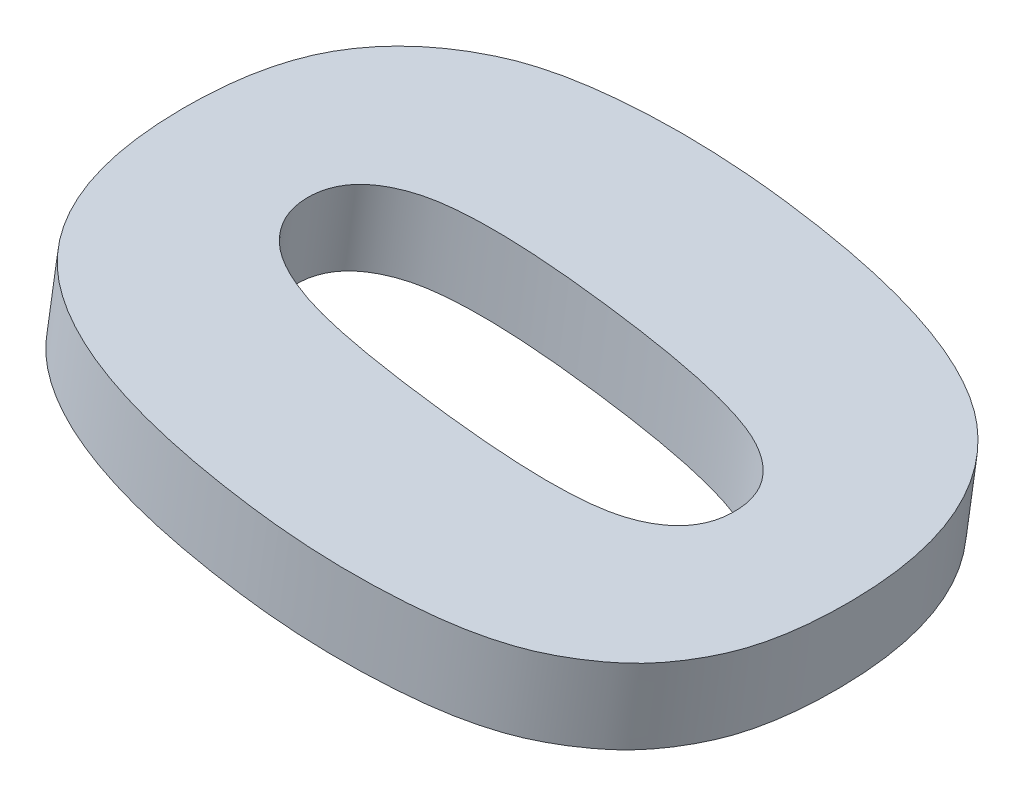
ISO-10303-21;
HEADER;
FILE_DESCRIPTION(('STEP AP214'),'2;1');
FILE_NAME('part.step','',(''),(''),'','','');
FILE_SCHEMA(('AUTOMOTIVE_DESIGN { 1 0 10303 214 1 1 1 1 }'));
ENDSEC;
DATA;
#1=APPLICATION_CONTEXT('core data for automotive mechanical design processes');
#2=APPLICATION_PROTOCOL_DEFINITION('international standard','automotive_design',2000,#1);
#3=PRODUCT_CONTEXT('',#1,'mechanical');
#4=PRODUCT('Part','Part','',(#3));
#5=PRODUCT_RELATED_PRODUCT_CATEGORY('part','',(#4));
#6=PRODUCT_DEFINITION_FORMATION('','',#4);
#7=PRODUCT_DEFINITION_CONTEXT('part definition',#1,'design');
#8=PRODUCT_DEFINITION('design','',#6,#7);
#9=PRODUCT_DEFINITION_SHAPE('','',#8);
#10=(LENGTH_UNIT() NAMED_UNIT(*) SI_UNIT(.MILLI.,.METRE.));
#11=(NAMED_UNIT(*) PLANE_ANGLE_UNIT() SI_UNIT($,.RADIAN.));
#12=(NAMED_UNIT(*) SI_UNIT($,.STERADIAN.) SOLID_ANGLE_UNIT());
#13=UNCERTAINTY_MEASURE_WITH_UNIT(LENGTH_MEASURE(1.E-05),#10,'distance_accuracy_value','');
#14=(GEOMETRIC_REPRESENTATION_CONTEXT(3) GLOBAL_UNCERTAINTY_ASSIGNED_CONTEXT((#13)) GLOBAL_UNIT_ASSIGNED_CONTEXT((#10,
#11,#12)) REPRESENTATION_CONTEXT('',''));
#15=CARTESIAN_POINT('',(0.,0.,0.));
#16=DIRECTION('',(0.,0.,1.));
#17=DIRECTION('',(1.,0.,0.));
#18=AXIS2_PLACEMENT_3D('',#15,#16,#17);
#19=CARTESIAN_POINT('',(844.513384833249,617.732570236416,2588.69411825762));
#20=CARTESIAN_POINT('',(867.101764245744,614.557980539209,2588.69411825762));
#21=CARTESIAN_POINT('',(876.127178850794,613.295858792178,2596.90693988577));
#22=CARTESIAN_POINT('',(885.152593455844,612.033737045148,2605.11976151392));
#23=CARTESIAN_POINT('',(885.154375306636,612.046415572319,2621.92739647385));
#24=CARTESIAN_POINT('',(885.155231520652,612.05250785161,2630.00379249356));
#25=CARTESIAN_POINT('',(883.183350857784,612.33362543138,2635.18796561432));
#26=CARTESIAN_POINT('',(881.211470194915,612.614743011151,2640.37213873507));
#27=CARTESIAN_POINT('',(878.050524974661,613.061503517472,2643.64635333766));
#28=CARTESIAN_POINT('',(874.889579754406,613.508264023792,2646.92056794024));
#29=CARTESIAN_POINT('',(871.404251899606,613.999543120022,2648.80324133673));
#30=CARTESIAN_POINT('',(867.918924044806,614.490822216253,2650.68591473322));
#31=CARTESIAN_POINT('',(863.275818466317,615.144262639921,2651.84875180586));
#32=CARTESIAN_POINT('',(854.409486429717,616.392052435875,2654.06926982256));
#33=CARTESIAN_POINT('',(844.790511464587,617.743911206456,2654.06926982256));
#34=CARTESIAN_POINT('',(823.228876570842,620.774201371972,2654.06926982256));
#35=CARTESIAN_POINT('',(813.230846303302,622.173665981263,2646.70228696674));
#36=CARTESIAN_POINT('',(803.232816035762,623.573130590554,2639.33530411092));
#37=CARTESIAN_POINT('',(803.230906909914,623.559546454299,2621.32712379671));
#38=CARTESIAN_POINT('',(803.229836642393,623.551931105186,2611.23162877208));
#39=CARTESIAN_POINT('',(806.417489052835,623.099150384108,2605.01062102716));
#40=CARTESIAN_POINT('',(809.605141463277,622.64636966303,2598.78961328225));
#41=CARTESIAN_POINT('',(815.748887883955,621.779838493564,2594.7805181873));
#42=CARTESIAN_POINT('',(820.142053637802,621.16021411494,2591.91376261683));
#43=CARTESIAN_POINT('',(827.73438849375,620.091942712191,2590.30394043722));
#44=CARTESIAN_POINT('',(835.326723349699,619.023671309443,2588.69411825762));
#45=CARTESIAN_POINT('',(844.513384833249,617.732570236416,2588.69411825762));
#46=B_SPLINE_CURVE_WITH_KNOTS('',2,(#19,#20,#21,#22,#23,#24,#25,#26,#27,#28,#29,#30,#31,#32,#33,
#34,#35,#36,#37,#38,#39,#40,#41,#42,#43,#44,#45),.UNSPECIFIED.,.T.,.F.,(3,2,2,2,2,2,2,2,2,2,2,2,
2,3),(0.,1.,2.,3.,4.,5.,6.,7.,8.,9.,10.,11.,12.,13.),.UNSPECIFIED.);
#47=DIRECTION('',(-0.139173060582166,-0.990267781437723,0.000761744447259926));
#48=VECTOR('',#47,1.);
#49=SURFACE_OF_LINEAR_EXTRUSION('',#46,#48);
#50=CARTESIAN_POINT('',(844.513384833249,617.732570236416,2588.69411825762));
#51=VERTEX_POINT('',#50);
#52=EDGE_CURVE('E25',#51,#51,#46,.T.);
#53=ORIENTED_EDGE('',*,*,#52,.T.);
#54=EDGE_LOOP('',(#53));
#55=FACE_BOUND('',#54,.T.);
#56=CARTESIAN_POINT('',(843.121654227428,607.829892422038,2588.70173570209));
#57=CARTESIAN_POINT('',(865.710033639923,604.655302724832,2588.70173570209));
#58=CARTESIAN_POINT('',(874.735448244972,603.393180977801,2596.91455733024));
#59=CARTESIAN_POINT('',(883.760862850022,602.131059230771,2605.12737895839));
#60=CARTESIAN_POINT('',(883.762644700814,602.143737757942,2621.93501391832));
#61=CARTESIAN_POINT('',(883.763500914831,602.149830037233,2630.01140993803));
#62=CARTESIAN_POINT('',(881.791620251962,602.430947617003,2635.19558305879));
#63=CARTESIAN_POINT('',(879.819739589094,602.712065196774,2640.37975617954));
#64=CARTESIAN_POINT('',(876.658794368839,603.158825703094,2643.65397078213));
#65=CARTESIAN_POINT('',(873.497849148584,603.605586209415,2646.92818538472));
#66=CARTESIAN_POINT('',(870.012521293784,604.096865305645,2648.8108587812));
#67=CARTESIAN_POINT('',(866.527193438984,604.588144401875,2650.69353217769));
#68=CARTESIAN_POINT('',(861.884087860495,605.241584825544,2651.85636925032));
#69=CARTESIAN_POINT('',(853.017755823895,606.489374621498,2654.07688726703));
#70=CARTESIAN_POINT('',(843.398780858766,607.841233392079,2654.07688726703));
#71=CARTESIAN_POINT('',(821.83714596502,610.871523557595,2654.07688726703));
#72=CARTESIAN_POINT('',(811.83911569748,612.270988166886,2646.70990441121));
#73=CARTESIAN_POINT('',(801.841085429941,613.670452776177,2639.34292155539));
#74=CARTESIAN_POINT('',(801.839176304092,613.656868639921,2621.33474124118));
#75=CARTESIAN_POINT('',(801.838106036571,613.649253290808,2611.23924621655));
#76=CARTESIAN_POINT('',(805.025758447013,613.196472569731,2605.01823847163));
#77=CARTESIAN_POINT('',(808.213410857456,612.743691848653,2598.79723072673));
#78=CARTESIAN_POINT('',(814.357157278134,611.877160679187,2594.78813563177));
#79=CARTESIAN_POINT('',(818.75032303198,611.257536300563,2591.9213800613));
#80=CARTESIAN_POINT('',(826.342657887929,610.189264897814,2590.3115578817));
#81=CARTESIAN_POINT('',(833.934992743877,609.120993495065,2588.70173570209));
#82=CARTESIAN_POINT('',(843.121654227428,607.829892422038,2588.70173570209));
#83=B_SPLINE_CURVE_WITH_KNOTS('',2,(#56,#57,#58,#59,#60,#61,#62,#63,#64,#65,#66,#67,#68,#69,#70,
#71,#72,#73,#74,#75,#76,#77,#78,#79,#80,#81,#82),.UNSPECIFIED.,.T.,.F.,(3,2,2,2,2,2,2,2,2,2,2,2,
2,3),(0.,1.,2.,3.,4.,5.,6.,7.,8.,9.,10.,11.,12.,13.),.UNSPECIFIED.);
#84=CARTESIAN_POINT('',(843.121654227428,607.829892422038,2588.70173570209));
#85=VERTEX_POINT('',#84);
#86=EDGE_CURVE('E36',#85,#85,#83,.T.);
#87=ORIENTED_EDGE('',*,*,#86,.F.);
#88=EDGE_LOOP('',(#87));
#89=FACE_BOUND('',#88,.T.);
#90=ADVANCED_FACE('F15',(#55,#89),#49,.T.);
#91=CARTESIAN_POINT('',(844.461682880908,617.756795224511,2610.74049658168));
#92=CARTESIAN_POINT('',(829.330711025648,619.883314638908,2610.74049658168));
#93=CARTESIAN_POINT('',(823.791980911796,620.663810259259,2613.44172362882));
#94=CARTESIAN_POINT('',(818.253250797944,621.44430587961,2616.14295067595));
#95=CARTESIAN_POINT('',(818.253794609549,621.448175300241,2621.27255355333));
#96=CARTESIAN_POINT('',(818.2541532938,621.450727471295,2624.65590864267));
#97=CARTESIAN_POINT('',(820.605121077843,621.122230455085,2627.1388547163));
#98=CARTESIAN_POINT('',(822.956088861885,620.793733438876,2629.62180078992));
#99=CARTESIAN_POINT('',(828.035896652879,620.080715519673,2630.79506102252));
#100=CARTESIAN_POINT('',(833.115704443872,619.36769760047,2631.96832125511));
#101=CARTESIAN_POINT('',(843.869502298146,617.856349873809,2631.96832125511));
#102=CARTESIAN_POINT('',(859.648944375774,615.638693913081,2631.96832125511));
#103=CARTESIAN_POINT('',(865.079596119231,614.873387717118,2629.26709420797));
#104=CARTESIAN_POINT('',(870.510247862689,614.108081521155,2626.56586716084));
#105=CARTESIAN_POINT('',(870.509675124934,614.104006280278,2621.16341306658));
#106=CARTESIAN_POINT('',(870.50909081672,614.099848711303,2615.65181848556));
#107=CARTESIAN_POINT('',(864.969813998648,614.876454329,2613.19615753362));
#108=CARTESIAN_POINT('',(859.430537180576,615.653059946696,2610.74049658168));
#109=CARTESIAN_POINT('',(844.461682880908,617.756795224511,2610.74049658168));
#110=B_SPLINE_CURVE_WITH_KNOTS('',2,(#91,#92,#93,#94,#95,#96,#97,#98,#99,#100,#101,#102,#103,
#104,#105,#106,#107,#108,#109),.UNSPECIFIED.,.T.,.F.,(3,2,2,2,2,2,2,2,2,3),(0.,1.,2.,3.,4.,5.,
6.,7.,8.,9.),.UNSPECIFIED.);
#111=DIRECTION('',(-0.139173060582166,-0.990267781437723,0.000761744447259926));
#112=VECTOR('',#111,1.);
#113=SURFACE_OF_LINEAR_EXTRUSION('',#110,#112);
#114=CARTESIAN_POINT('',(844.461682880908,617.756795224511,2610.74049658168));
#115=VERTEX_POINT('',#114);
#116=EDGE_CURVE('E10',#115,#115,#110,.T.);
#117=ORIENTED_EDGE('',*,*,#116,.T.);
#118=EDGE_LOOP('',(#117));
#119=FACE_BOUND('',#118,.T.);
#120=CARTESIAN_POINT('',(843.069952275086,607.854117410133,2610.74811402616));
#121=CARTESIAN_POINT('',(827.938980419827,609.98063682453,2610.74811402616));
#122=CARTESIAN_POINT('',(822.400250305974,610.761132444882,2613.44934107329));
#123=CARTESIAN_POINT('',(816.861520192123,611.541628065233,2616.15056812043));
#124=CARTESIAN_POINT('',(816.862064003728,611.545497485864,2621.2801709978));
#125=CARTESIAN_POINT('',(816.862422687978,611.548049656918,2624.66352608714));
#126=CARTESIAN_POINT('',(819.213390472021,611.219552640708,2627.14647216077));
#127=CARTESIAN_POINT('',(821.564358256064,610.891055624498,2629.62941823439));
#128=CARTESIAN_POINT('',(826.644166047057,610.178037705295,2630.80267846699));
#129=CARTESIAN_POINT('',(831.72397383805,609.465019786093,2631.97593869958));
#130=CARTESIAN_POINT('',(842.477771692324,607.953672059432,2631.97593869958));
#131=CARTESIAN_POINT('',(858.257213769952,605.736016098704,2631.97593869958));
#132=CARTESIAN_POINT('',(863.68786551341,604.970709902741,2629.27471165245));
#133=CARTESIAN_POINT('',(869.118517256867,604.205403706778,2626.57348460531));
#134=CARTESIAN_POINT('',(869.117944519112,604.201328465901,2621.17103051105));
#135=CARTESIAN_POINT('',(869.117360210898,604.197170896926,2615.65943593004));
#136=CARTESIAN_POINT('',(863.578083392826,604.973776514623,2613.20377497809));
#137=CARTESIAN_POINT('',(858.038806574754,605.750382132319,2610.74811402616));
#138=CARTESIAN_POINT('',(843.069952275086,607.854117410133,2610.74811402616));
#139=B_SPLINE_CURVE_WITH_KNOTS('',2,(#120,#121,#122,#123,#124,#125,#126,#127,#128,#129,#130,
#131,#132,#133,#134,#135,#136,#137,#138),.UNSPECIFIED.,.T.,.F.,(3,2,2,2,2,2,2,2,2,3),(0.,1.,2.,
3.,4.,5.,6.,7.,8.,9.),.UNSPECIFIED.);
#140=CARTESIAN_POINT('',(843.069952275086,607.854117410133,2610.74811402616));
#141=VERTEX_POINT('',#140);
#142=EDGE_CURVE('E19',#141,#141,#139,.T.);
#143=ORIENTED_EDGE('',*,*,#142,.F.);
#144=EDGE_LOOP('',(#143));
#145=FACE_BOUND('',#144,.T.);
#146=ADVANCED_FACE('F42',(#119,#145),#113,.T.);
#147=CARTESIAN_POINT('',(854.221325697585,616.418069679532,2653.51414031838));
#148=DIRECTION('',(0.139173060582166,0.990267781437723,-0.000761744447259926));
#149=DIRECTION('',(-0.947941965636704,0.133001987377289,-0.289338039563609));
#150=AXIS2_PLACEMENT_3D('',#147,#148,#149);
#151=PLANE('',#150);
#152=ORIENTED_EDGE('',*,*,#52,.F.);
#153=EDGE_LOOP('',(#152));
#154=FACE_BOUND('',#153,.T.);
#155=ORIENTED_EDGE('',*,*,#116,.F.);
#156=EDGE_LOOP('',(#155));
#157=FACE_BOUND('',#156,.T.);
#158=ADVANCED_FACE('F45',(#154,#157),#151,.T.);
#159=CARTESIAN_POINT('',(852.829595091763,606.515391865155,2653.52175776285));
#160=DIRECTION('',(0.139173060582166,0.990267781437723,-0.000761744447259926));
#161=DIRECTION('',(-0.947941965636704,0.133001987377289,-0.289338039563609));
#162=AXIS2_PLACEMENT_3D('',#159,#160,#161);
#163=PLANE('',#162);
#164=ORIENTED_EDGE('',*,*,#86,.T.);
#165=EDGE_LOOP('',(#164));
#166=FACE_BOUND('',#165,.T.);
#167=ORIENTED_EDGE('',*,*,#142,.T.);
#168=EDGE_LOOP('',(#167));
#169=FACE_BOUND('',#168,.T.);
#170=ADVANCED_FACE('F46',(#166,#169),#163,.F.);
#171=CLOSED_SHELL('',(#90,#146,#158,#170));
#172=MANIFOLD_SOLID_BREP('B1',#171);
#173=ADVANCED_BREP_SHAPE_REPRESENTATION('',(#18,#172),#14);
#174=SHAPE_DEFINITION_REPRESENTATION(#9,#173);
ENDSEC;
END-ISO-10303-21;
